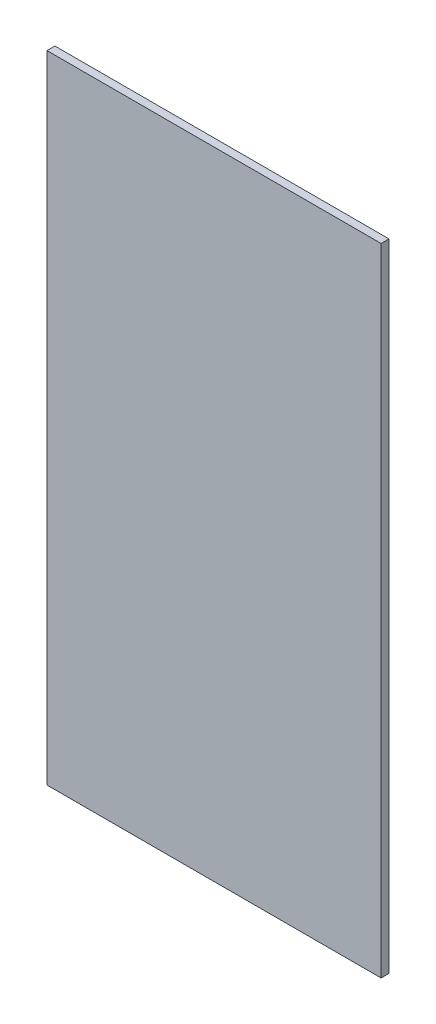
ISO-10303-21;
HEADER;
FILE_DESCRIPTION(('STEP AP214'),'2;1');
FILE_NAME('part.step','',(''),(''),'','','');
FILE_SCHEMA(('AUTOMOTIVE_DESIGN { 1 0 10303 214 1 1 1 1 }'));
ENDSEC;
DATA;
#1=APPLICATION_CONTEXT('core data for automotive mechanical design processes');
#2=APPLICATION_PROTOCOL_DEFINITION('international standard','automotive_design',2000,#1);
#3=PRODUCT_CONTEXT('',#1,'mechanical');
#4=PRODUCT('Part','Part','',(#3));
#5=PRODUCT_RELATED_PRODUCT_CATEGORY('part','',(#4));
#6=PRODUCT_DEFINITION_FORMATION('','',#4);
#7=PRODUCT_DEFINITION_CONTEXT('part definition',#1,'design');
#8=PRODUCT_DEFINITION('design','',#6,#7);
#9=PRODUCT_DEFINITION_SHAPE('','',#8);
#10=(LENGTH_UNIT() NAMED_UNIT(*) SI_UNIT(.MILLI.,.METRE.));
#11=(NAMED_UNIT(*) PLANE_ANGLE_UNIT() SI_UNIT($,.RADIAN.));
#12=(NAMED_UNIT(*) SI_UNIT($,.STERADIAN.) SOLID_ANGLE_UNIT());
#13=UNCERTAINTY_MEASURE_WITH_UNIT(LENGTH_MEASURE(1.E-05),#10,'distance_accuracy_value','');
#14=(GEOMETRIC_REPRESENTATION_CONTEXT(3) GLOBAL_UNCERTAINTY_ASSIGNED_CONTEXT((#13)) GLOBAL_UNIT_ASSIGNED_CONTEXT((#10,
#11,#12)) REPRESENTATION_CONTEXT('',''));
#15=CARTESIAN_POINT('',(0.,0.,0.));
#16=DIRECTION('',(0.,0.,1.));
#17=DIRECTION('',(1.,0.,0.));
#18=AXIS2_PLACEMENT_3D('',#15,#16,#17);
#19=CARTESIAN_POINT('',(-63.373,-120.65,2.9972));
#20=DIRECTION('',(1.,0.,0.));
#21=DIRECTION('',(0.,0.,-1.));
#22=AXIS2_PLACEMENT_3D('',#19,#20,#21);
#23=PLANE('',#22);
#24=DIRECTION('',(0.,-1.,0.));
#25=VECTOR('',#24,1.);
#26=CARTESIAN_POINT('',(-63.373,-120.65,0.));
#27=LINE('',#26,#25);
#28=CARTESIAN_POINT('',(-63.373,120.65,0.));
#29=VERTEX_POINT('',#28);
#30=CARTESIAN_POINT('',(-63.373,-120.65,0.));
#31=VERTEX_POINT('',#30);
#32=EDGE_CURVE('E107',#29,#31,#27,.T.);
#33=ORIENTED_EDGE('',*,*,#32,.T.);
#34=DIRECTION('',(0.,0.,-1.));
#35=VECTOR('',#34,1.);
#36=CARTESIAN_POINT('',(-63.373,-120.65,2.9972));
#37=LINE('',#36,#35);
#38=CARTESIAN_POINT('',(-63.373,-120.65,2.9972));
#39=VERTEX_POINT('',#38);
#40=EDGE_CURVE('E11',#39,#31,#37,.T.);
#41=ORIENTED_EDGE('',*,*,#40,.F.);
#42=DIRECTION('',(0.,-1.,0.));
#43=VECTOR('',#42,1.);
#44=CARTESIAN_POINT('',(-63.373,-120.65,2.9972));
#45=LINE('',#44,#43);
#46=CARTESIAN_POINT('',(-63.373,120.65,2.9972));
#47=VERTEX_POINT('',#46);
#48=EDGE_CURVE('E91',#47,#39,#45,.T.);
#49=ORIENTED_EDGE('',*,*,#48,.F.);
#50=DIRECTION('',(0.,0.,-1.));
#51=VECTOR('',#50,1.);
#52=CARTESIAN_POINT('',(-63.373,120.65,2.9972));
#53=LINE('',#52,#51);
#54=EDGE_CURVE('E103',#47,#29,#53,.T.);
#55=ORIENTED_EDGE('',*,*,#54,.T.);
#56=EDGE_LOOP('',(#33,#41,#49,#55));
#57=FACE_BOUND('',#56,.T.);
#58=ADVANCED_FACE('F39',(#57),#23,.F.);
#59=CARTESIAN_POINT('',(63.373,-120.65,2.9972));
#60=DIRECTION('',(0.,1.,0.));
#61=DIRECTION('',(-1.,0.,0.));
#62=AXIS2_PLACEMENT_3D('',#59,#60,#61);
#63=PLANE('',#62);
#64=DIRECTION('',(1.,0.,0.));
#65=VECTOR('',#64,1.);
#66=CARTESIAN_POINT('',(63.373,-120.65,0.));
#67=LINE('',#66,#65);
#68=CARTESIAN_POINT('',(63.373,-120.65,0.));
#69=VERTEX_POINT('',#68);
#70=EDGE_CURVE('E96',#31,#69,#67,.T.);
#71=ORIENTED_EDGE('',*,*,#70,.T.);
#72=DIRECTION('',(0.,0.,-1.));
#73=VECTOR('',#72,1.);
#74=CARTESIAN_POINT('',(63.373,-120.65,2.9972));
#75=LINE('',#74,#73);
#76=CARTESIAN_POINT('',(63.373,-120.65,2.9972));
#77=VERTEX_POINT('',#76);
#78=EDGE_CURVE('E48',#77,#69,#75,.T.);
#79=ORIENTED_EDGE('',*,*,#78,.F.);
#80=DIRECTION('',(1.,0.,0.));
#81=VECTOR('',#80,1.);
#82=CARTESIAN_POINT('',(63.373,-120.65,2.9972));
#83=LINE('',#82,#81);
#84=EDGE_CURVE('E86',#39,#77,#83,.T.);
#85=ORIENTED_EDGE('',*,*,#84,.F.);
#86=ORIENTED_EDGE('',*,*,#40,.T.);
#87=EDGE_LOOP('',(#71,#79,#85,#86));
#88=FACE_BOUND('',#87,.T.);
#89=ADVANCED_FACE('F95',(#88),#63,.F.);
#90=CARTESIAN_POINT('',(63.373,-120.65,2.9972));
#91=DIRECTION('',(-1.,0.,0.));
#92=DIRECTION('',(0.,0.,1.));
#93=AXIS2_PLACEMENT_3D('',#90,#91,#92);
#94=PLANE('',#93);
#95=DIRECTION('',(0.,1.,0.));
#96=VECTOR('',#95,1.);
#97=CARTESIAN_POINT('',(63.373,-120.65,0.));
#98=LINE('',#97,#96);
#99=CARTESIAN_POINT('',(63.373,120.65,0.));
#100=VERTEX_POINT('',#99);
#101=EDGE_CURVE('E73',#69,#100,#98,.T.);
#102=ORIENTED_EDGE('',*,*,#101,.T.);
#103=DIRECTION('',(0.,0.,-1.));
#104=VECTOR('',#103,1.);
#105=CARTESIAN_POINT('',(63.373,120.65,2.9972));
#106=LINE('',#105,#104);
#107=CARTESIAN_POINT('',(63.373,120.65,2.9972));
#108=VERTEX_POINT('',#107);
#109=EDGE_CURVE('E98',#108,#100,#106,.T.);
#110=ORIENTED_EDGE('',*,*,#109,.F.);
#111=DIRECTION('',(0.,1.,0.));
#112=VECTOR('',#111,1.);
#113=CARTESIAN_POINT('',(63.373,-120.65,2.9972));
#114=LINE('',#113,#112);
#115=EDGE_CURVE('E89',#77,#108,#114,.T.);
#116=ORIENTED_EDGE('',*,*,#115,.F.);
#117=ORIENTED_EDGE('',*,*,#78,.T.);
#118=EDGE_LOOP('',(#102,#110,#116,#117));
#119=FACE_BOUND('',#118,.T.);
#120=ADVANCED_FACE('F99',(#119),#94,.F.);
#121=CARTESIAN_POINT('',(63.373,120.65,2.9972));
#122=DIRECTION('',(0.,-1.,0.));
#123=DIRECTION('',(1.,0.,0.));
#124=AXIS2_PLACEMENT_3D('',#121,#122,#123);
#125=PLANE('',#124);
#126=DIRECTION('',(-1.,0.,0.));
#127=VECTOR('',#126,1.);
#128=CARTESIAN_POINT('',(63.373,120.65,0.));
#129=LINE('',#128,#127);
#130=EDGE_CURVE('E79',#100,#29,#129,.T.);
#131=ORIENTED_EDGE('',*,*,#130,.T.);
#132=ORIENTED_EDGE('',*,*,#54,.F.);
#133=DIRECTION('',(-1.,0.,0.));
#134=VECTOR('',#133,1.);
#135=CARTESIAN_POINT('',(63.373,120.65,2.9972));
#136=LINE('',#135,#134);
#137=EDGE_CURVE('E56',#108,#47,#136,.T.);
#138=ORIENTED_EDGE('',*,*,#137,.F.);
#139=ORIENTED_EDGE('',*,*,#109,.T.);
#140=EDGE_LOOP('',(#131,#132,#138,#139));
#141=FACE_BOUND('',#140,.T.);
#142=ADVANCED_FACE('F120',(#141),#125,.F.);
#143=CARTESIAN_POINT('',(0.,0.,2.9972));
#144=DIRECTION('',(0.,0.,1.));
#145=DIRECTION('',(1.,0.,0.));
#146=AXIS2_PLACEMENT_3D('',#143,#144,#145);
#147=PLANE('',#146);
#148=ORIENTED_EDGE('',*,*,#48,.T.);
#149=ORIENTED_EDGE('',*,*,#84,.T.);
#150=ORIENTED_EDGE('',*,*,#115,.T.);
#151=ORIENTED_EDGE('',*,*,#137,.T.);
#152=EDGE_LOOP('',(#148,#149,#150,#151));
#153=FACE_BOUND('',#152,.T.);
#154=ADVANCED_FACE('F87',(#153),#147,.T.);
#155=CARTESIAN_POINT('',(0.,0.,0.));
#156=DIRECTION('',(0.,0.,1.));
#157=DIRECTION('',(1.,0.,0.));
#158=AXIS2_PLACEMENT_3D('',#155,#156,#157);
#159=PLANE('',#158);
#160=ORIENTED_EDGE('',*,*,#32,.F.);
#161=ORIENTED_EDGE('',*,*,#130,.F.);
#162=ORIENTED_EDGE('',*,*,#101,.F.);
#163=ORIENTED_EDGE('',*,*,#70,.F.);
#164=EDGE_LOOP('',(#160,#161,#162,#163));
#165=FACE_BOUND('',#164,.T.);
#166=ADVANCED_FACE('F123',(#165),#159,.F.);
#167=CLOSED_SHELL('',(#58,#89,#120,#142,#154,#166));
#168=MANIFOLD_SOLID_BREP('B2',#167);
#169=ADVANCED_BREP_SHAPE_REPRESENTATION('',(#18,#168),#14);
#170=SHAPE_DEFINITION_REPRESENTATION(#9,#169);
ENDSEC;
END-ISO-10303-21;
